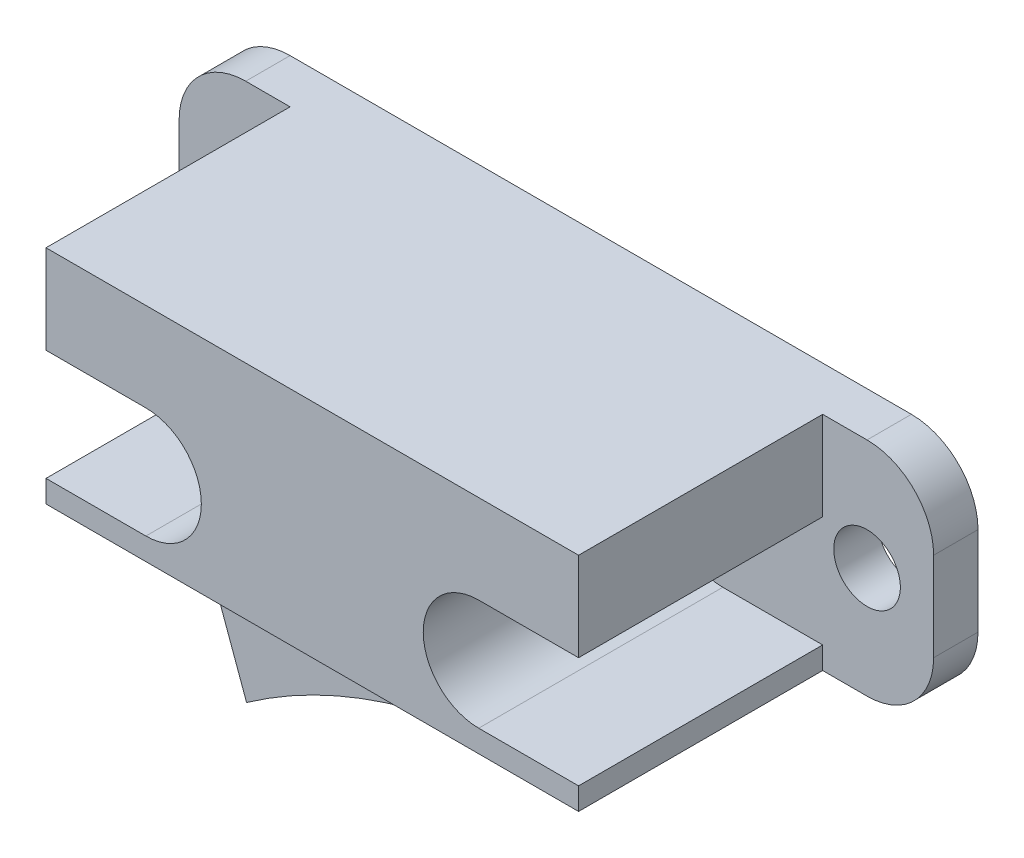
ISO-10303-21;
HEADER;
FILE_DESCRIPTION(('STEP AP214'),'2;1');
FILE_NAME('part.step','',(''),(''),'','','');
FILE_SCHEMA(('AUTOMOTIVE_DESIGN { 1 0 10303 214 1 1 1 1 }'));
ENDSEC;
DATA;
#1=APPLICATION_CONTEXT('core data for automotive mechanical design processes');
#2=APPLICATION_PROTOCOL_DEFINITION('international standard','automotive_design',2000,#1);
#3=PRODUCT_CONTEXT('',#1,'mechanical');
#4=PRODUCT('Part','Part','',(#3));
#5=PRODUCT_RELATED_PRODUCT_CATEGORY('part','',(#4));
#6=PRODUCT_DEFINITION_FORMATION('','',#4);
#7=PRODUCT_DEFINITION_CONTEXT('part definition',#1,'design');
#8=PRODUCT_DEFINITION('design','',#6,#7);
#9=PRODUCT_DEFINITION_SHAPE('','',#8);
#10=(LENGTH_UNIT() NAMED_UNIT(*) SI_UNIT(.MILLI.,.METRE.));
#11=(NAMED_UNIT(*) PLANE_ANGLE_UNIT() SI_UNIT($,.RADIAN.));
#12=(NAMED_UNIT(*) SI_UNIT($,.STERADIAN.) SOLID_ANGLE_UNIT());
#13=UNCERTAINTY_MEASURE_WITH_UNIT(LENGTH_MEASURE(1.E-05),#10,'distance_accuracy_value','');
#14=(GEOMETRIC_REPRESENTATION_CONTEXT(3) GLOBAL_UNCERTAINTY_ASSIGNED_CONTEXT((#13)) GLOBAL_UNIT_ASSIGNED_CONTEXT((#10,
#11,#12)) REPRESENTATION_CONTEXT('',''));
#15=CARTESIAN_POINT('',(0.,0.,0.));
#16=DIRECTION('',(0.,0.,1.));
#17=DIRECTION('',(1.,0.,0.));
#18=AXIS2_PLACEMENT_3D('',#15,#16,#17);
#19=CARTESIAN_POINT('',(17.,-5.,2.));
#20=DIRECTION('',(0.,1.,0.));
#21=DIRECTION('',(-1.,0.,0.));
#22=AXIS2_PLACEMENT_3D('',#19,#20,#21);
#23=PLANE('',#22);
#24=DIRECTION('',(0.,0.,-1.));
#25=VECTOR('',#24,1.);
#26=CARTESIAN_POINT('',(-10.5,-5.,-1.));
#27=LINE('',#26,#25);
#28=CARTESIAN_POINT('',(-10.5,-5.,13.));
#29=VERTEX_POINT('',#28);
#30=CARTESIAN_POINT('',(-10.5,-5.,0.));
#31=VERTEX_POINT('',#30);
#32=EDGE_CURVE('E263',#29,#31,#27,.T.);
#33=ORIENTED_EDGE('',*,*,#32,.F.);
#34=DIRECTION('',(1.,0.,0.));
#35=VECTOR('',#34,1.);
#36=CARTESIAN_POINT('',(12.,-5.,13.));
#37=LINE('',#36,#35);
#38=CARTESIAN_POINT('',(-12.,-5.,13.));
#39=VERTEX_POINT('',#38);
#40=EDGE_CURVE('E587',#39,#29,#37,.T.);
#41=ORIENTED_EDGE('',*,*,#40,.F.);
#42=DIRECTION('',(0.,0.,-1.));
#43=VECTOR('',#42,1.);
#44=CARTESIAN_POINT('',(-12.,-5.,13.));
#45=LINE('',#44,#43);
#46=CARTESIAN_POINT('',(-12.,-5.,2.));
#47=VERTEX_POINT('',#46);
#48=EDGE_CURVE('E504',#39,#47,#45,.T.);
#49=ORIENTED_EDGE('',*,*,#48,.T.);
#50=DIRECTION('',(1.,0.,0.));
#51=VECTOR('',#50,1.);
#52=CARTESIAN_POINT('',(17.,-5.,2.));
#53=LINE('',#52,#51);
#54=CARTESIAN_POINT('',(-14.,-5.,2.));
#55=VERTEX_POINT('',#54);
#56=EDGE_CURVE('E426',#55,#47,#53,.T.);
#57=ORIENTED_EDGE('',*,*,#56,.F.);
#58=DIRECTION('',(0.,0.,-1.));
#59=VECTOR('',#58,1.);
#60=CARTESIAN_POINT('',(-14.,-5.,2.));
#61=LINE('',#60,#59);
#62=CARTESIAN_POINT('',(-14.,-5.,0.));
#63=VERTEX_POINT('',#62);
#64=EDGE_CURVE('E405',#55,#63,#61,.T.);
#65=ORIENTED_EDGE('',*,*,#64,.T.);
#66=DIRECTION('',(1.,0.,0.));
#67=VECTOR('',#66,1.);
#68=CARTESIAN_POINT('',(17.,-5.,0.));
#69=LINE('',#68,#67);
#70=EDGE_CURVE('E477',#63,#31,#69,.T.);
#71=ORIENTED_EDGE('',*,*,#70,.T.);
#72=EDGE_LOOP('',(#33,#41,#49,#57,#65,#71));
#73=FACE_BOUND('',#72,.T.);
#74=ADVANCED_FACE('F35',(#73),#23,.F.);
#75=DIRECTION('',(0.,0.,1.));
#76=VECTOR('',#75,1.);
#77=CARTESIAN_POINT('',(10.5,-5.,-0.999999999999997));
#78=LINE('',#77,#76);
#79=CARTESIAN_POINT('',(10.5,-5.,0.));
#80=VERTEX_POINT('',#79);
#81=CARTESIAN_POINT('',(10.5,-5.,13.));
#82=VERTEX_POINT('',#81);
#83=EDGE_CURVE('E673',#80,#82,#78,.T.);
#84=ORIENTED_EDGE('',*,*,#83,.F.);
#85=CARTESIAN_POINT('',(14.,-5.,0.));
#86=VERTEX_POINT('',#85);
#87=EDGE_CURVE('E475',#80,#86,#69,.T.);
#88=ORIENTED_EDGE('',*,*,#87,.T.);
#89=DIRECTION('',(0.,0.,-1.));
#90=VECTOR('',#89,1.);
#91=CARTESIAN_POINT('',(14.,-5.,2.));
#92=LINE('',#91,#90);
#93=CARTESIAN_POINT('',(14.,-5.,2.));
#94=VERTEX_POINT('',#93);
#95=EDGE_CURVE('E413',#86,#94,#92,.F.);
#96=ORIENTED_EDGE('',*,*,#95,.T.);
#97=CARTESIAN_POINT('',(12.,-5.,2.));
#98=VERTEX_POINT('',#97);
#99=EDGE_CURVE('E430',#98,#94,#53,.T.);
#100=ORIENTED_EDGE('',*,*,#99,.F.);
#101=DIRECTION('',(0.,0.,-1.));
#102=VECTOR('',#101,1.);
#103=CARTESIAN_POINT('',(12.,-5.,13.));
#104=LINE('',#103,#102);
#105=CARTESIAN_POINT('',(12.,-5.,13.));
#106=VERTEX_POINT('',#105);
#107=EDGE_CURVE('E508',#106,#98,#104,.T.);
#108=ORIENTED_EDGE('',*,*,#107,.F.);
#109=EDGE_CURVE('E584',#82,#106,#37,.T.);
#110=ORIENTED_EDGE('',*,*,#109,.F.);
#111=EDGE_LOOP('',(#84,#88,#96,#100,#108,#110));
#112=FACE_BOUND('',#111,.T.);
#113=ADVANCED_FACE('F382',(#112),#23,.F.);
#114=CARTESIAN_POINT('',(0.,0.,2.));
#115=DIRECTION('',(0.,0.,1.));
#116=DIRECTION('',(1.,0.,0.));
#117=AXIS2_PLACEMENT_3D('',#114,#115,#116);
#118=PLANE('',#117);
#119=DIRECTION('',(0.,1.,0.));
#120=VECTOR('',#119,1.);
#121=CARTESIAN_POINT('',(12.,5.,2.));
#122=LINE('',#121,#120);
#123=CARTESIAN_POINT('',(12.,0.999999999999997,2.));
#124=VERTEX_POINT('',#123);
#125=CARTESIAN_POINT('',(12.,5.,2.));
#126=VERTEX_POINT('',#125);
#127=EDGE_CURVE('E524',#124,#126,#122,.T.);
#128=ORIENTED_EDGE('',*,*,#127,.F.);
#129=DIRECTION('',(1.,0.,0.));
#130=VECTOR('',#129,1.);
#131=CARTESIAN_POINT('',(12.,0.999999999999997,2.));
#132=LINE('',#131,#130);
#133=CARTESIAN_POINT('',(7.5,0.999999999999997,2.));
#134=VERTEX_POINT('',#133);
#135=EDGE_CURVE('E521',#134,#124,#132,.T.);
#136=ORIENTED_EDGE('',*,*,#135,.F.);
#137=CARTESIAN_POINT('',(7.5,-1.5,2.));
#138=DIRECTION('',(0.,0.,-1.));
#139=DIRECTION('',(1.,0.,0.));
#140=AXIS2_PLACEMENT_3D('',#137,#138,#139);
#141=CIRCLE('',#140,2.5);
#142=CARTESIAN_POINT('',(7.5,-4.,2.));
#143=VERTEX_POINT('',#142);
#144=EDGE_CURVE('E554',#143,#134,#141,.T.);
#145=ORIENTED_EDGE('',*,*,#144,.F.);
#146=DIRECTION('',(-1.,0.,0.));
#147=VECTOR('',#146,1.);
#148=CARTESIAN_POINT('',(12.,-4.,2.));
#149=LINE('',#148,#147);
#150=CARTESIAN_POINT('',(12.,-4.,2.));
#151=VERTEX_POINT('',#150);
#152=EDGE_CURVE('E538',#151,#143,#149,.T.);
#153=ORIENTED_EDGE('',*,*,#152,.F.);
#154=DIRECTION('',(0.,1.,0.));
#155=VECTOR('',#154,1.);
#156=CARTESIAN_POINT('',(12.,-5.,2.));
#157=LINE('',#156,#155);
#158=EDGE_CURVE('E535',#98,#151,#157,.T.);
#159=ORIENTED_EDGE('',*,*,#158,.F.);
#160=ORIENTED_EDGE('',*,*,#99,.T.);
#161=CARTESIAN_POINT('',(14.,-2.,2.));
#162=DIRECTION('',(0.,0.,1.));
#163=DIRECTION('',(1.,0.,0.));
#164=AXIS2_PLACEMENT_3D('',#161,#162,#163);
#165=CIRCLE('',#164,3.);
#166=CARTESIAN_POINT('',(17.,-2.,2.));
#167=VERTEX_POINT('',#166);
#168=EDGE_CURVE('E411',#94,#167,#165,.T.);
#169=ORIENTED_EDGE('',*,*,#168,.T.);
#170=DIRECTION('',(0.,1.,0.));
#171=VECTOR('',#170,1.);
#172=CARTESIAN_POINT('',(17.,-5.,2.));
#173=LINE('',#172,#171);
#174=CARTESIAN_POINT('',(17.,2.,2.));
#175=VERTEX_POINT('',#174);
#176=EDGE_CURVE('E429',#167,#175,#173,.T.);
#177=ORIENTED_EDGE('',*,*,#176,.T.);
#178=CARTESIAN_POINT('',(14.,2.,2.));
#179=DIRECTION('',(0.,0.,1.));
#180=DIRECTION('',(1.,0.,0.));
#181=AXIS2_PLACEMENT_3D('',#178,#179,#180);
#182=CIRCLE('',#181,3.);
#183=CARTESIAN_POINT('',(14.,5.,2.));
#184=VERTEX_POINT('',#183);
#185=EDGE_CURVE('E408',#175,#184,#182,.T.);
#186=ORIENTED_EDGE('',*,*,#185,.T.);
#187=DIRECTION('',(-1.,0.,0.));
#188=VECTOR('',#187,1.);
#189=CARTESIAN_POINT('',(17.,5.,2.));
#190=LINE('',#189,#188);
#191=EDGE_CURVE('E448',#184,#126,#190,.T.);
#192=ORIENTED_EDGE('',*,*,#191,.T.);
#193=EDGE_LOOP('',(#128,#136,#145,#153,#159,#160,#169,#177,#186,#192));
#194=FACE_BOUND('',#193,.T.);
#195=CARTESIAN_POINT('',(14.,0.,2.));
#196=DIRECTION('',(0.,0.,1.));
#197=DIRECTION('',(-1.,0.,0.));
#198=AXIS2_PLACEMENT_3D('',#195,#196,#197);
#199=CIRCLE('',#198,1.5);
#200=CARTESIAN_POINT('',(12.5,0.,2.));
#201=VERTEX_POINT('',#200);
#202=EDGE_CURVE('E486',#201,#201,#199,.T.);
#203=ORIENTED_EDGE('',*,*,#202,.F.);
#204=EDGE_LOOP('',(#203));
#205=FACE_BOUND('',#204,.T.);
#206=ADVANCED_FACE('F367',(#194,#205),#118,.T.);
#207=CARTESIAN_POINT('',(-17.,-5.,2.));
#208=DIRECTION('',(1.,0.,0.));
#209=DIRECTION('',(0.,0.,-1.));
#210=AXIS2_PLACEMENT_3D('',#207,#208,#209);
#211=PLANE('',#210);
#212=DIRECTION('',(0.,-1.,0.));
#213=VECTOR('',#212,1.);
#214=CARTESIAN_POINT('',(-17.,-5.,0.));
#215=LINE('',#214,#213);
#216=CARTESIAN_POINT('',(-17.,2.,0.));
#217=VERTEX_POINT('',#216);
#218=CARTESIAN_POINT('',(-17.,-2.,0.));
#219=VERTEX_POINT('',#218);
#220=EDGE_CURVE('E443',#217,#219,#215,.T.);
#221=ORIENTED_EDGE('',*,*,#220,.T.);
#222=DIRECTION('',(0.,0.,-1.));
#223=VECTOR('',#222,1.);
#224=CARTESIAN_POINT('',(-17.,-2.,2.));
#225=LINE('',#224,#223);
#226=CARTESIAN_POINT('',(-17.,-2.,2.));
#227=VERTEX_POINT('',#226);
#228=EDGE_CURVE('E11',#219,#227,#225,.F.);
#229=ORIENTED_EDGE('',*,*,#228,.T.);
#230=DIRECTION('',(0.,-1.,0.));
#231=VECTOR('',#230,1.);
#232=CARTESIAN_POINT('',(-17.,-5.,2.));
#233=LINE('',#232,#231);
#234=CARTESIAN_POINT('',(-17.,2.,2.));
#235=VERTEX_POINT('',#234);
#236=EDGE_CURVE('E435',#235,#227,#233,.T.);
#237=ORIENTED_EDGE('',*,*,#236,.F.);
#238=DIRECTION('',(0.,0.,-1.));
#239=VECTOR('',#238,1.);
#240=CARTESIAN_POINT('',(-17.,2.,2.));
#241=LINE('',#240,#239);
#242=EDGE_CURVE('E46',#235,#217,#241,.T.);
#243=ORIENTED_EDGE('',*,*,#242,.T.);
#244=EDGE_LOOP('',(#221,#229,#237,#243));
#245=FACE_BOUND('',#244,.T.);
#246=ADVANCED_FACE('F378',(#245),#211,.F.);
#247=CARTESIAN_POINT('',(17.,-5.,2.));
#248=DIRECTION('',(-1.,0.,0.));
#249=DIRECTION('',(0.,0.,1.));
#250=AXIS2_PLACEMENT_3D('',#247,#248,#249);
#251=PLANE('',#250);
#252=ORIENTED_EDGE('',*,*,#176,.F.);
#253=DIRECTION('',(0.,0.,-1.));
#254=VECTOR('',#253,1.);
#255=CARTESIAN_POINT('',(17.,-2.,2.));
#256=LINE('',#255,#254);
#257=CARTESIAN_POINT('',(17.,-2.,0.));
#258=VERTEX_POINT('',#257);
#259=EDGE_CURVE('E453',#167,#258,#256,.T.);
#260=ORIENTED_EDGE('',*,*,#259,.T.);
#261=DIRECTION('',(0.,1.,0.));
#262=VECTOR('',#261,1.);
#263=CARTESIAN_POINT('',(17.,-5.,0.));
#264=LINE('',#263,#262);
#265=CARTESIAN_POINT('',(17.,2.,0.));
#266=VERTEX_POINT('',#265);
#267=EDGE_CURVE('E611',#258,#266,#264,.T.);
#268=ORIENTED_EDGE('',*,*,#267,.T.);
#269=DIRECTION('',(0.,0.,-1.));
#270=VECTOR('',#269,1.);
#271=CARTESIAN_POINT('',(17.,2.,2.));
#272=LINE('',#271,#270);
#273=EDGE_CURVE('E449',#266,#175,#272,.F.);
#274=ORIENTED_EDGE('',*,*,#273,.T.);
#275=EDGE_LOOP('',(#252,#260,#268,#274));
#276=FACE_BOUND('',#275,.T.);
#277=ADVANCED_FACE('F374',(#276),#251,.F.);
#278=CARTESIAN_POINT('',(17.,5.,2.));
#279=DIRECTION('',(0.,-1.,0.));
#280=DIRECTION('',(1.,0.,0.));
#281=AXIS2_PLACEMENT_3D('',#278,#279,#280);
#282=PLANE('',#281);
#283=ORIENTED_EDGE('',*,*,#191,.F.);
#284=DIRECTION('',(0.,0.,-1.));
#285=VECTOR('',#284,1.);
#286=CARTESIAN_POINT('',(14.,5.,2.));
#287=LINE('',#286,#285);
#288=CARTESIAN_POINT('',(14.,5.,0.));
#289=VERTEX_POINT('',#288);
#290=EDGE_CURVE('E421',#184,#289,#287,.T.);
#291=ORIENTED_EDGE('',*,*,#290,.T.);
#292=DIRECTION('',(-1.,0.,0.));
#293=VECTOR('',#292,1.);
#294=CARTESIAN_POINT('',(17.,5.,0.));
#295=LINE('',#294,#293);
#296=CARTESIAN_POINT('',(-14.,5.,0.));
#297=VERTEX_POINT('',#296);
#298=EDGE_CURVE('E466',#289,#297,#295,.T.);
#299=ORIENTED_EDGE('',*,*,#298,.T.);
#300=DIRECTION('',(0.,0.,-1.));
#301=VECTOR('',#300,1.);
#302=CARTESIAN_POINT('',(-14.,5.,2.));
#303=LINE('',#302,#301);
#304=CARTESIAN_POINT('',(-14.,5.,2.));
#305=VERTEX_POINT('',#304);
#306=EDGE_CURVE('E418',#297,#305,#303,.F.);
#307=ORIENTED_EDGE('',*,*,#306,.T.);
#308=CARTESIAN_POINT('',(-12.,5.,2.));
#309=VERTEX_POINT('',#308);
#310=EDGE_CURVE('E440',#309,#305,#190,.T.);
#311=ORIENTED_EDGE('',*,*,#310,.F.);
#312=DIRECTION('',(0.,0.,-1.));
#313=VECTOR('',#312,1.);
#314=CARTESIAN_POINT('',(-12.,5.,13.));
#315=LINE('',#314,#313);
#316=CARTESIAN_POINT('',(-12.,5.,13.));
#317=VERTEX_POINT('',#316);
#318=EDGE_CURVE('E489',#317,#309,#315,.T.);
#319=ORIENTED_EDGE('',*,*,#318,.F.);
#320=DIRECTION('',(-1.,0.,0.));
#321=VECTOR('',#320,1.);
#322=CARTESIAN_POINT('',(-12.,5.,13.));
#323=LINE('',#322,#321);
#324=CARTESIAN_POINT('',(12.,5.,13.));
#325=VERTEX_POINT('',#324);
#326=EDGE_CURVE('E527',#325,#317,#323,.T.);
#327=ORIENTED_EDGE('',*,*,#326,.F.);
#328=DIRECTION('',(0.,0.,-1.));
#329=VECTOR('',#328,1.);
#330=CARTESIAN_POINT('',(12.,5.,13.));
#331=LINE('',#330,#329);
#332=EDGE_CURVE('E518',#325,#126,#331,.T.);
#333=ORIENTED_EDGE('',*,*,#332,.T.);
#334=EDGE_LOOP('',(#283,#291,#299,#307,#311,#319,#327,#333));
#335=FACE_BOUND('',#334,.T.);
#336=ADVANCED_FACE('F365',(#335),#282,.F.);
#337=DIRECTION('',(0.,-1.,0.));
#338=VECTOR('',#337,1.);
#339=CARTESIAN_POINT('',(-12.,-5.,2.));
#340=LINE('',#339,#338);
#341=CARTESIAN_POINT('',(-12.,-4.,2.));
#342=VERTEX_POINT('',#341);
#343=EDGE_CURVE('E539',#342,#47,#340,.T.);
#344=ORIENTED_EDGE('',*,*,#343,.F.);
#345=DIRECTION('',(-1.,0.,0.));
#346=VECTOR('',#345,1.);
#347=CARTESIAN_POINT('',(-12.,-4.,2.));
#348=LINE('',#347,#346);
#349=CARTESIAN_POINT('',(-7.5,-4.,2.));
#350=VERTEX_POINT('',#349);
#351=EDGE_CURVE('E548',#350,#342,#348,.T.);
#352=ORIENTED_EDGE('',*,*,#351,.F.);
#353=CARTESIAN_POINT('',(-7.5,-1.5,2.));
#354=DIRECTION('',(0.,0.,-1.));
#355=DIRECTION('',(-1.,0.,0.));
#356=AXIS2_PLACEMENT_3D('',#353,#354,#355);
#357=CIRCLE('',#356,2.5);
#358=CARTESIAN_POINT('',(-7.5,0.999999999999997,2.));
#359=VERTEX_POINT('',#358);
#360=EDGE_CURVE('E572',#359,#350,#357,.T.);
#361=ORIENTED_EDGE('',*,*,#360,.F.);
#362=DIRECTION('',(1.,0.,0.));
#363=VECTOR('',#362,1.);
#364=CARTESIAN_POINT('',(-12.,0.999999999999997,2.));
#365=LINE('',#364,#363);
#366=CARTESIAN_POINT('',(-12.,0.999999999999997,2.));
#367=VERTEX_POINT('',#366);
#368=EDGE_CURVE('E570',#367,#359,#365,.T.);
#369=ORIENTED_EDGE('',*,*,#368,.F.);
#370=DIRECTION('',(0.,-1.,0.));
#371=VECTOR('',#370,1.);
#372=CARTESIAN_POINT('',(-12.,5.,2.));
#373=LINE('',#372,#371);
#374=EDGE_CURVE('E460',#309,#367,#373,.T.);
#375=ORIENTED_EDGE('',*,*,#374,.F.);
#376=ORIENTED_EDGE('',*,*,#310,.T.);
#377=CARTESIAN_POINT('',(-14.,2.,2.));
#378=DIRECTION('',(0.,0.,1.));
#379=DIRECTION('',(1.,0.,0.));
#380=AXIS2_PLACEMENT_3D('',#377,#378,#379);
#381=CIRCLE('',#380,3.);
#382=EDGE_CURVE('E409',#305,#235,#381,.T.);
#383=ORIENTED_EDGE('',*,*,#382,.T.);
#384=ORIENTED_EDGE('',*,*,#236,.T.);
#385=CARTESIAN_POINT('',(-14.,-2.,2.));
#386=DIRECTION('',(0.,0.,1.));
#387=DIRECTION('',(1.,0.,0.));
#388=AXIS2_PLACEMENT_3D('',#385,#386,#387);
#389=CIRCLE('',#388,3.);
#390=EDGE_CURVE('E403',#227,#55,#389,.T.);
#391=ORIENTED_EDGE('',*,*,#390,.T.);
#392=ORIENTED_EDGE('',*,*,#56,.T.);
#393=EDGE_LOOP('',(#344,#352,#361,#369,#375,#376,#383,#384,#391,#392));
#394=FACE_BOUND('',#393,.T.);
#395=CARTESIAN_POINT('',(-14.,0.,2.));
#396=DIRECTION('',(0.,0.,1.));
#397=DIRECTION('',(1.,0.,0.));
#398=AXIS2_PLACEMENT_3D('',#395,#396,#397);
#399=CIRCLE('',#398,1.5);
#400=CARTESIAN_POINT('',(-12.5,0.,2.));
#401=VERTEX_POINT('',#400);
#402=EDGE_CURVE('E479',#401,#401,#399,.T.);
#403=ORIENTED_EDGE('',*,*,#402,.F.);
#404=EDGE_LOOP('',(#403));
#405=FACE_BOUND('',#404,.T.);
#406=ADVANCED_FACE('F361',(#394,#405),#118,.T.);
#407=CARTESIAN_POINT('',(0.,0.,0.));
#408=DIRECTION('',(0.,0.,1.));
#409=DIRECTION('',(1.,0.,0.));
#410=AXIS2_PLACEMENT_3D('',#407,#408,#409);
#411=PLANE('',#410);
#412=CARTESIAN_POINT('',(14.,0.,0.));
#413=DIRECTION('',(0.,0.,1.));
#414=DIRECTION('',(-1.,0.,0.));
#415=AXIS2_PLACEMENT_3D('',#412,#413,#414);
#416=CIRCLE('',#415,1.5);
#417=CARTESIAN_POINT('',(12.5,0.,0.));
#418=VERTEX_POINT('',#417);
#419=EDGE_CURVE('E484',#418,#418,#416,.T.);
#420=ORIENTED_EDGE('',*,*,#419,.T.);
#421=EDGE_LOOP('',(#420));
#422=FACE_BOUND('',#421,.T.);
#423=CARTESIAN_POINT('',(-14.,0.,0.));
#424=DIRECTION('',(0.,0.,1.));
#425=DIRECTION('',(1.,0.,0.));
#426=AXIS2_PLACEMENT_3D('',#423,#424,#425);
#427=CIRCLE('',#426,1.5);
#428=CARTESIAN_POINT('',(-12.5,0.,0.));
#429=VERTEX_POINT('',#428);
#430=EDGE_CURVE('E476',#429,#429,#427,.T.);
#431=ORIENTED_EDGE('',*,*,#430,.T.);
#432=EDGE_LOOP('',(#431));
#433=FACE_BOUND('',#432,.T.);
#434=ORIENTED_EDGE('',*,*,#267,.F.);
#435=CARTESIAN_POINT('',(14.,-2.,0.));
#436=DIRECTION('',(0.,0.,1.));
#437=DIRECTION('',(1.,0.,0.));
#438=AXIS2_PLACEMENT_3D('',#435,#436,#437);
#439=CIRCLE('',#438,3.);
#440=EDGE_CURVE('E622',#258,#86,#439,.F.);
#441=ORIENTED_EDGE('',*,*,#440,.T.);
#442=ORIENTED_EDGE('',*,*,#87,.F.);
#443=DIRECTION('',(1.,0.,0.));
#444=VECTOR('',#443,1.);
#445=CARTESIAN_POINT('',(0.,-5.,0.));
#446=LINE('',#445,#444);
#447=EDGE_CURVE('E629',#31,#80,#446,.T.);
#448=ORIENTED_EDGE('',*,*,#447,.F.);
#449=ORIENTED_EDGE('',*,*,#70,.F.);
#450=CARTESIAN_POINT('',(-14.,-2.,0.));
#451=DIRECTION('',(0.,0.,1.));
#452=DIRECTION('',(1.,0.,0.));
#453=AXIS2_PLACEMENT_3D('',#450,#451,#452);
#454=CIRCLE('',#453,3.);
#455=EDGE_CURVE('E474',#63,#219,#454,.F.);
#456=ORIENTED_EDGE('',*,*,#455,.T.);
#457=ORIENTED_EDGE('',*,*,#220,.F.);
#458=CARTESIAN_POINT('',(-14.,2.,0.));
#459=DIRECTION('',(0.,0.,1.));
#460=DIRECTION('',(1.,0.,0.));
#461=AXIS2_PLACEMENT_3D('',#458,#459,#460);
#462=CIRCLE('',#461,3.);
#463=EDGE_CURVE('E468',#217,#297,#462,.F.);
#464=ORIENTED_EDGE('',*,*,#463,.T.);
#465=ORIENTED_EDGE('',*,*,#298,.F.);
#466=CARTESIAN_POINT('',(14.,2.,0.));
#467=DIRECTION('',(0.,0.,1.));
#468=DIRECTION('',(1.,0.,0.));
#469=AXIS2_PLACEMENT_3D('',#466,#467,#468);
#470=CIRCLE('',#469,3.);
#471=EDGE_CURVE('E620',#289,#266,#470,.F.);
#472=ORIENTED_EDGE('',*,*,#471,.T.);
#473=EDGE_LOOP('',(#434,#441,#442,#448,#449,#456,#457,#464,#465,#472));
#474=FACE_BOUND('',#473,.T.);
#475=ADVANCED_FACE('F364',(#422,#433,#474),#411,.F.);
#476=CARTESIAN_POINT('',(14.,-2.,2.));
#477=DIRECTION('',(0.,0.,-1.));
#478=DIRECTION('',(-1.,0.,0.));
#479=AXIS2_PLACEMENT_3D('',#476,#477,#478);
#480=CYLINDRICAL_SURFACE('',#479,3.);
#481=ORIENTED_EDGE('',*,*,#168,.F.);
#482=ORIENTED_EDGE('',*,*,#95,.F.);
#483=ORIENTED_EDGE('',*,*,#440,.F.);
#484=ORIENTED_EDGE('',*,*,#259,.F.);
#485=EDGE_LOOP('',(#481,#482,#483,#484));
#486=FACE_BOUND('',#485,.T.);
#487=ADVANCED_FACE('F370',(#486),#480,.T.);
#488=CARTESIAN_POINT('',(14.,2.,2.));
#489=DIRECTION('',(0.,0.,-1.));
#490=DIRECTION('',(-1.,0.,0.));
#491=AXIS2_PLACEMENT_3D('',#488,#489,#490);
#492=CYLINDRICAL_SURFACE('',#491,3.);
#493=ORIENTED_EDGE('',*,*,#185,.F.);
#494=ORIENTED_EDGE('',*,*,#273,.F.);
#495=ORIENTED_EDGE('',*,*,#471,.F.);
#496=ORIENTED_EDGE('',*,*,#290,.F.);
#497=EDGE_LOOP('',(#493,#494,#495,#496));
#498=FACE_BOUND('',#497,.T.);
#499=ADVANCED_FACE('F389',(#498),#492,.T.);
#500=CARTESIAN_POINT('',(-14.,-2.,2.));
#501=DIRECTION('',(0.,0.,-1.));
#502=DIRECTION('',(-1.,0.,0.));
#503=AXIS2_PLACEMENT_3D('',#500,#501,#502);
#504=CYLINDRICAL_SURFACE('',#503,3.);
#505=ORIENTED_EDGE('',*,*,#390,.F.);
#506=ORIENTED_EDGE('',*,*,#228,.F.);
#507=ORIENTED_EDGE('',*,*,#455,.F.);
#508=ORIENTED_EDGE('',*,*,#64,.F.);
#509=EDGE_LOOP('',(#505,#506,#507,#508));
#510=FACE_BOUND('',#509,.T.);
#511=ADVANCED_FACE('F392',(#510),#504,.T.);
#512=CARTESIAN_POINT('',(-14.,2.,2.));
#513=DIRECTION('',(0.,0.,-1.));
#514=DIRECTION('',(-1.,0.,0.));
#515=AXIS2_PLACEMENT_3D('',#512,#513,#514);
#516=CYLINDRICAL_SURFACE('',#515,3.);
#517=ORIENTED_EDGE('',*,*,#382,.F.);
#518=ORIENTED_EDGE('',*,*,#306,.F.);
#519=ORIENTED_EDGE('',*,*,#463,.F.);
#520=ORIENTED_EDGE('',*,*,#242,.F.);
#521=EDGE_LOOP('',(#517,#518,#519,#520));
#522=FACE_BOUND('',#521,.T.);
#523=ADVANCED_FACE('F37',(#522),#516,.T.);
#524=CARTESIAN_POINT('',(-14.,0.,0.));
#525=DIRECTION('',(0.,0.,1.));
#526=DIRECTION('',(1.,0.,0.));
#527=AXIS2_PLACEMENT_3D('',#524,#525,#526);
#528=CYLINDRICAL_SURFACE('',#527,1.5);
#529=ORIENTED_EDGE('',*,*,#430,.F.);
#530=EDGE_LOOP('',(#529));
#531=FACE_BOUND('',#530,.T.);
#532=ORIENTED_EDGE('',*,*,#402,.T.);
#533=EDGE_LOOP('',(#532));
#534=FACE_BOUND('',#533,.T.);
#535=ADVANCED_FACE('F356',(#531,#534),#528,.F.);
#536=CARTESIAN_POINT('',(14.,0.,0.));
#537=DIRECTION('',(0.,0.,1.));
#538=DIRECTION('',(1.,0.,0.));
#539=AXIS2_PLACEMENT_3D('',#536,#537,#538);
#540=CYLINDRICAL_SURFACE('',#539,1.5);
#541=ORIENTED_EDGE('',*,*,#419,.F.);
#542=EDGE_LOOP('',(#541));
#543=FACE_BOUND('',#542,.T.);
#544=ORIENTED_EDGE('',*,*,#202,.T.);
#545=EDGE_LOOP('',(#544));
#546=FACE_BOUND('',#545,.T.);
#547=ADVANCED_FACE('F352',(#543,#546),#540,.F.);
#548=CARTESIAN_POINT('',(-12.,5.,13.));
#549=DIRECTION('',(1.,0.,0.));
#550=DIRECTION('',(0.,0.,-1.));
#551=AXIS2_PLACEMENT_3D('',#548,#549,#550);
#552=PLANE('',#551);
#553=ORIENTED_EDGE('',*,*,#374,.T.);
#554=DIRECTION('',(0.,0.,-1.));
#555=VECTOR('',#554,1.);
#556=CARTESIAN_POINT('',(-12.,0.999999999999997,13.));
#557=LINE('',#556,#555);
#558=CARTESIAN_POINT('',(-12.,0.999999999999997,13.));
#559=VERTEX_POINT('',#558);
#560=EDGE_CURVE('E492',#559,#367,#557,.T.);
#561=ORIENTED_EDGE('',*,*,#560,.F.);
#562=DIRECTION('',(0.,-1.,0.));
#563=VECTOR('',#562,1.);
#564=CARTESIAN_POINT('',(-12.,5.,13.));
#565=LINE('',#564,#563);
#566=EDGE_CURVE('E642',#317,#559,#565,.T.);
#567=ORIENTED_EDGE('',*,*,#566,.F.);
#568=ORIENTED_EDGE('',*,*,#318,.T.);
#569=EDGE_LOOP('',(#553,#561,#567,#568));
#570=FACE_BOUND('',#569,.T.);
#571=ADVANCED_FACE('F348',(#570),#552,.F.);
#572=CARTESIAN_POINT('',(-12.,0.999999999999997,13.));
#573=DIRECTION('',(0.,1.,0.));
#574=DIRECTION('',(0.,0.,1.));
#575=AXIS2_PLACEMENT_3D('',#572,#573,#574);
#576=PLANE('',#575);
#577=ORIENTED_EDGE('',*,*,#368,.T.);
#578=DIRECTION('',(0.,0.,-1.));
#579=VECTOR('',#578,1.);
#580=CARTESIAN_POINT('',(-7.5,0.999999999999997,13.));
#581=LINE('',#580,#579);
#582=CARTESIAN_POINT('',(-7.5,0.999999999999997,13.));
#583=VERTEX_POINT('',#582);
#584=EDGE_CURVE('E495',#583,#359,#581,.T.);
#585=ORIENTED_EDGE('',*,*,#584,.F.);
#586=DIRECTION('',(1.,0.,0.));
#587=VECTOR('',#586,1.);
#588=CARTESIAN_POINT('',(-12.,0.999999999999997,13.));
#589=LINE('',#588,#587);
#590=EDGE_CURVE('E644',#559,#583,#589,.T.);
#591=ORIENTED_EDGE('',*,*,#590,.F.);
#592=ORIENTED_EDGE('',*,*,#560,.T.);
#593=EDGE_LOOP('',(#577,#585,#591,#592));
#594=FACE_BOUND('',#593,.T.);
#595=ADVANCED_FACE('F344',(#594),#576,.F.);
#596=CARTESIAN_POINT('',(-7.5,-1.5,13.));
#597=DIRECTION('',(0.,0.,-1.));
#598=DIRECTION('',(-1.,0.,0.));
#599=AXIS2_PLACEMENT_3D('',#596,#597,#598);
#600=CYLINDRICAL_SURFACE('',#599,2.5);
#601=ORIENTED_EDGE('',*,*,#360,.T.);
#602=DIRECTION('',(0.,0.,-1.));
#603=VECTOR('',#602,1.);
#604=CARTESIAN_POINT('',(-7.5,-4.,13.));
#605=LINE('',#604,#603);
#606=CARTESIAN_POINT('',(-7.5,-4.,13.));
#607=VERTEX_POINT('',#606);
#608=EDGE_CURVE('E498',#607,#350,#605,.T.);
#609=ORIENTED_EDGE('',*,*,#608,.F.);
#610=CARTESIAN_POINT('',(-7.5,-1.5,13.));
#611=DIRECTION('',(0.,0.,-1.));
#612=DIRECTION('',(-1.,0.,0.));
#613=AXIS2_PLACEMENT_3D('',#610,#611,#612);
#614=CIRCLE('',#613,2.5);
#615=EDGE_CURVE('E589',#583,#607,#614,.T.);
#616=ORIENTED_EDGE('',*,*,#615,.F.);
#617=ORIENTED_EDGE('',*,*,#584,.T.);
#618=EDGE_LOOP('',(#601,#609,#616,#617));
#619=FACE_BOUND('',#618,.T.);
#620=ADVANCED_FACE('F340',(#619),#600,.F.);
#621=CARTESIAN_POINT('',(-12.,-4.,13.));
#622=DIRECTION('',(0.,-1.,0.));
#623=DIRECTION('',(0.,0.,-1.));
#624=AXIS2_PLACEMENT_3D('',#621,#622,#623);
#625=PLANE('',#624);
#626=ORIENTED_EDGE('',*,*,#351,.T.);
#627=DIRECTION('',(0.,0.,-1.));
#628=VECTOR('',#627,1.);
#629=CARTESIAN_POINT('',(-12.,-4.,13.));
#630=LINE('',#629,#628);
#631=CARTESIAN_POINT('',(-12.,-4.,13.));
#632=VERTEX_POINT('',#631);
#633=EDGE_CURVE('E501',#632,#342,#630,.T.);
#634=ORIENTED_EDGE('',*,*,#633,.F.);
#635=DIRECTION('',(-1.,0.,0.));
#636=VECTOR('',#635,1.);
#637=CARTESIAN_POINT('',(-12.,-4.,13.));
#638=LINE('',#637,#636);
#639=EDGE_CURVE('E585',#607,#632,#638,.T.);
#640=ORIENTED_EDGE('',*,*,#639,.F.);
#641=ORIENTED_EDGE('',*,*,#608,.T.);
#642=EDGE_LOOP('',(#626,#634,#640,#641));
#643=FACE_BOUND('',#642,.T.);
#644=ADVANCED_FACE('F336',(#643),#625,.F.);
#645=CARTESIAN_POINT('',(-12.,-5.,13.));
#646=DIRECTION('',(1.,0.,0.));
#647=DIRECTION('',(0.,0.,-1.));
#648=AXIS2_PLACEMENT_3D('',#645,#646,#647);
#649=PLANE('',#648);
#650=ORIENTED_EDGE('',*,*,#343,.T.);
#651=ORIENTED_EDGE('',*,*,#48,.F.);
#652=DIRECTION('',(0.,-1.,0.));
#653=VECTOR('',#652,1.);
#654=CARTESIAN_POINT('',(-12.,-5.,13.));
#655=LINE('',#654,#653);
#656=EDGE_CURVE('E581',#632,#39,#655,.T.);
#657=ORIENTED_EDGE('',*,*,#656,.F.);
#658=ORIENTED_EDGE('',*,*,#633,.T.);
#659=EDGE_LOOP('',(#650,#651,#657,#658));
#660=FACE_BOUND('',#659,.T.);
#661=ADVANCED_FACE('F332',(#660),#649,.F.);
#662=CARTESIAN_POINT('',(12.,-5.,13.));
#663=DIRECTION('',(-1.,0.,0.));
#664=DIRECTION('',(0.,0.,1.));
#665=AXIS2_PLACEMENT_3D('',#662,#663,#664);
#666=PLANE('',#665);
#667=ORIENTED_EDGE('',*,*,#158,.T.);
#668=DIRECTION('',(0.,0.,-1.));
#669=VECTOR('',#668,1.);
#670=CARTESIAN_POINT('',(12.,-4.,13.));
#671=LINE('',#670,#669);
#672=CARTESIAN_POINT('',(12.,-4.,13.));
#673=VERTEX_POINT('',#672);
#674=EDGE_CURVE('E505',#673,#151,#671,.T.);
#675=ORIENTED_EDGE('',*,*,#674,.F.);
#676=DIRECTION('',(0.,1.,0.));
#677=VECTOR('',#676,1.);
#678=CARTESIAN_POINT('',(12.,-5.,13.));
#679=LINE('',#678,#677);
#680=EDGE_CURVE('E593',#106,#673,#679,.T.);
#681=ORIENTED_EDGE('',*,*,#680,.F.);
#682=ORIENTED_EDGE('',*,*,#107,.T.);
#683=EDGE_LOOP('',(#667,#675,#681,#682));
#684=FACE_BOUND('',#683,.T.);
#685=ADVANCED_FACE('F328',(#684),#666,.F.);
#686=CARTESIAN_POINT('',(12.,-4.,13.));
#687=DIRECTION('',(0.,-1.,0.));
#688=DIRECTION('',(0.,0.,-1.));
#689=AXIS2_PLACEMENT_3D('',#686,#687,#688);
#690=PLANE('',#689);
#691=ORIENTED_EDGE('',*,*,#152,.T.);
#692=DIRECTION('',(0.,0.,-1.));
#693=VECTOR('',#692,1.);
#694=CARTESIAN_POINT('',(7.5,-4.,13.));
#695=LINE('',#694,#693);
#696=CARTESIAN_POINT('',(7.5,-4.,13.));
#697=VERTEX_POINT('',#696);
#698=EDGE_CURVE('E509',#697,#143,#695,.T.);
#699=ORIENTED_EDGE('',*,*,#698,.F.);
#700=DIRECTION('',(-1.,0.,0.));
#701=VECTOR('',#700,1.);
#702=CARTESIAN_POINT('',(12.,-4.,13.));
#703=LINE('',#702,#701);
#704=EDGE_CURVE('E595',#673,#697,#703,.T.);
#705=ORIENTED_EDGE('',*,*,#704,.F.);
#706=ORIENTED_EDGE('',*,*,#674,.T.);
#707=EDGE_LOOP('',(#691,#699,#705,#706));
#708=FACE_BOUND('',#707,.T.);
#709=ADVANCED_FACE('F324',(#708),#690,.F.);
#710=CARTESIAN_POINT('',(7.5,-1.5,13.));
#711=DIRECTION('',(0.,0.,-1.));
#712=DIRECTION('',(-1.,0.,0.));
#713=AXIS2_PLACEMENT_3D('',#710,#711,#712);
#714=CYLINDRICAL_SURFACE('',#713,2.5);
#715=ORIENTED_EDGE('',*,*,#144,.T.);
#716=DIRECTION('',(0.,0.,-1.));
#717=VECTOR('',#716,1.);
#718=CARTESIAN_POINT('',(7.5,0.999999999999997,13.));
#719=LINE('',#718,#717);
#720=CARTESIAN_POINT('',(7.5,0.999999999999997,13.));
#721=VERTEX_POINT('',#720);
#722=EDGE_CURVE('E512',#721,#134,#719,.T.);
#723=ORIENTED_EDGE('',*,*,#722,.F.);
#724=CARTESIAN_POINT('',(7.5,-1.5,13.));
#725=DIRECTION('',(0.,0.,-1.));
#726=DIRECTION('',(1.,0.,0.));
#727=AXIS2_PLACEMENT_3D('',#724,#725,#726);
#728=CIRCLE('',#727,2.5);
#729=EDGE_CURVE('E566',#697,#721,#728,.T.);
#730=ORIENTED_EDGE('',*,*,#729,.F.);
#731=ORIENTED_EDGE('',*,*,#698,.T.);
#732=EDGE_LOOP('',(#715,#723,#730,#731));
#733=FACE_BOUND('',#732,.T.);
#734=ADVANCED_FACE('F320',(#733),#714,.F.);
#735=CARTESIAN_POINT('',(12.,0.999999999999997,13.));
#736=DIRECTION('',(0.,1.,0.));
#737=DIRECTION('',(0.,0.,1.));
#738=AXIS2_PLACEMENT_3D('',#735,#736,#737);
#739=PLANE('',#738);
#740=ORIENTED_EDGE('',*,*,#135,.T.);
#741=DIRECTION('',(0.,0.,-1.));
#742=VECTOR('',#741,1.);
#743=CARTESIAN_POINT('',(12.,0.999999999999997,13.));
#744=LINE('',#743,#742);
#745=CARTESIAN_POINT('',(12.,0.999999999999997,13.));
#746=VERTEX_POINT('',#745);
#747=EDGE_CURVE('E515',#746,#124,#744,.T.);
#748=ORIENTED_EDGE('',*,*,#747,.F.);
#749=DIRECTION('',(1.,0.,0.));
#750=VECTOR('',#749,1.);
#751=CARTESIAN_POINT('',(12.,0.999999999999997,13.));
#752=LINE('',#751,#750);
#753=EDGE_CURVE('E564',#721,#746,#752,.T.);
#754=ORIENTED_EDGE('',*,*,#753,.F.);
#755=ORIENTED_EDGE('',*,*,#722,.T.);
#756=EDGE_LOOP('',(#740,#748,#754,#755));
#757=FACE_BOUND('',#756,.T.);
#758=ADVANCED_FACE('F316',(#757),#739,.F.);
#759=CARTESIAN_POINT('',(12.,5.,13.));
#760=DIRECTION('',(-1.,0.,0.));
#761=DIRECTION('',(0.,0.,1.));
#762=AXIS2_PLACEMENT_3D('',#759,#760,#761);
#763=PLANE('',#762);
#764=ORIENTED_EDGE('',*,*,#127,.T.);
#765=ORIENTED_EDGE('',*,*,#332,.F.);
#766=DIRECTION('',(0.,1.,0.));
#767=VECTOR('',#766,1.);
#768=CARTESIAN_POINT('',(12.,5.,13.));
#769=LINE('',#768,#767);
#770=EDGE_CURVE('E532',#746,#325,#769,.T.);
#771=ORIENTED_EDGE('',*,*,#770,.F.);
#772=ORIENTED_EDGE('',*,*,#747,.T.);
#773=EDGE_LOOP('',(#764,#765,#771,#772));
#774=FACE_BOUND('',#773,.T.);
#775=ADVANCED_FACE('F312',(#774),#763,.F.);
#776=CARTESIAN_POINT('',(7.5,-1.5,13.));
#777=DIRECTION('',(0.,0.,1.));
#778=DIRECTION('',(1.,0.,0.));
#779=AXIS2_PLACEMENT_3D('',#776,#777,#778);
#780=PLANE('',#779);
#781=ORIENTED_EDGE('',*,*,#326,.T.);
#782=ORIENTED_EDGE('',*,*,#566,.T.);
#783=ORIENTED_EDGE('',*,*,#590,.T.);
#784=ORIENTED_EDGE('',*,*,#615,.T.);
#785=ORIENTED_EDGE('',*,*,#639,.T.);
#786=ORIENTED_EDGE('',*,*,#656,.T.);
#787=ORIENTED_EDGE('',*,*,#40,.T.);
#788=DIRECTION('',(-1.,0.,0.));
#789=VECTOR('',#788,1.);
#790=CARTESIAN_POINT('',(10.5,-5.,13.));
#791=LINE('',#790,#789);
#792=EDGE_CURVE('E664',#82,#29,#791,.T.);
#793=ORIENTED_EDGE('',*,*,#792,.F.);
#794=ORIENTED_EDGE('',*,*,#109,.T.);
#795=ORIENTED_EDGE('',*,*,#680,.T.);
#796=ORIENTED_EDGE('',*,*,#704,.T.);
#797=ORIENTED_EDGE('',*,*,#729,.T.);
#798=ORIENTED_EDGE('',*,*,#753,.T.);
#799=ORIENTED_EDGE('',*,*,#770,.T.);
#800=EDGE_LOOP('',(#781,#782,#783,#784,#785,#786,#787,#793,#794,#795,#796,#797,#798,#799));
#801=FACE_BOUND('',#800,.T.);
#802=ADVANCED_FACE('F294',(#801),#780,.T.);
#803=CARTESIAN_POINT('',(0.,-5.,0.));
#804=DIRECTION('',(0.,-1.,0.));
#805=DIRECTION('',(1.,0.,0.));
#806=AXIS2_PLACEMENT_3D('',#803,#804,#805);
#807=PLANE('',#806);
#808=CARTESIAN_POINT('',(-10.5,-5.,-1.));
#809=VERTEX_POINT('',#808);
#810=EDGE_CURVE('E272',#31,#809,#27,.T.);
#811=ORIENTED_EDGE('',*,*,#810,.F.);
#812=ORIENTED_EDGE('',*,*,#447,.T.);
#813=CARTESIAN_POINT('',(10.5,-5.,-0.999999999999997));
#814=VERTEX_POINT('',#813);
#815=EDGE_CURVE('E672',#814,#80,#78,.T.);
#816=ORIENTED_EDGE('',*,*,#815,.F.);
#817=DIRECTION('',(1.,0.,0.));
#818=VECTOR('',#817,1.);
#819=CARTESIAN_POINT('',(10.5,-5.,-0.999999999999997));
#820=LINE('',#819,#818);
#821=EDGE_CURVE('E674',#809,#814,#820,.T.);
#822=ORIENTED_EDGE('',*,*,#821,.F.);
#823=EDGE_LOOP('',(#811,#812,#816,#822));
#824=FACE_BOUND('',#823,.T.);
#825=ADVANCED_FACE('F289',(#824),#807,.F.);
#826=CARTESIAN_POINT('',(-10.5,-5.,-1.));
#827=DIRECTION('',(-0.669130606358857,-0.743144825477395,0.));
#828=DIRECTION('',(0.743144825477395,-0.669130606358857,0.));
#829=AXIS2_PLACEMENT_3D('',#826,#827,#828);
#830=PLANE('',#829);
#831=ORIENTED_EDGE('',*,*,#32,.T.);
#832=ORIENTED_EDGE('',*,*,#810,.T.);
#833=DIRECTION('',(-0.5964727848721,0.537066507812433,-0.5964727848721));
#834=VECTOR('',#833,1.);
#835=CARTESIAN_POINT('',(-3.02862455504534,-11.7272566671047,6.47137544495465));
#836=LINE('',#835,#834);
#837=CARTESIAN_POINT('',(-8.27877497034161,-7.,1.22122502965839));
#838=VERTEX_POINT('',#837);
#839=EDGE_CURVE('E632',#838,#809,#836,.T.);
#840=ORIENTED_EDGE('',*,*,#839,.F.);
#841=DIRECTION('',(0.,0.,1.));
#842=VECTOR('',#841,1.);
#843=CARTESIAN_POINT('',(-8.27877497034161,-7.,-1.));
#844=LINE('',#843,#842);
#845=CARTESIAN_POINT('',(-8.27877497034161,-7.,10.7787749703416));
#846=VERTEX_POINT('',#845);
#847=EDGE_CURVE('E661',#846,#838,#844,.F.);
#848=ORIENTED_EDGE('',*,*,#847,.F.);
#849=DIRECTION('',(-0.5964727848721,0.537066507812433,0.5964727848721));
#850=VECTOR('',#849,1.);
#851=CARTESIAN_POINT('',(-5.5190830366969,-9.48483777806982,8.0190830366969));
#852=LINE('',#851,#850);
#853=EDGE_CURVE('E656',#846,#29,#852,.T.);
#854=ORIENTED_EDGE('',*,*,#853,.T.);
#855=EDGE_LOOP('',(#831,#832,#840,#848,#854));
#856=FACE_BOUND('',#855,.T.);
#857=ADVANCED_FACE('F293',(#856),#830,.T.);
#858=CARTESIAN_POINT('',(10.5,-5.,-0.999999999999997));
#859=DIRECTION('',(0.,-0.743144825477395,-0.669130606358857));
#860=DIRECTION('',(0.,0.669130606358858,-0.743144825477395));
#861=AXIS2_PLACEMENT_3D('',#858,#859,#860);
#862=PLANE('',#861);
#863=ORIENTED_EDGE('',*,*,#821,.T.);
#864=DIRECTION('',(0.5964727848721,0.537066507812434,-0.5964727848721));
#865=VECTOR('',#864,1.);
#866=CARTESIAN_POINT('',(10.5,-5.,-0.999999999999997));
#867=LINE('',#866,#865);
#868=CARTESIAN_POINT('',(8.27877497034161,-7.,1.22122502965839));
#869=VERTEX_POINT('',#868);
#870=EDGE_CURVE('E635',#869,#814,#867,.T.);
#871=ORIENTED_EDGE('',*,*,#870,.F.);
#872=DIRECTION('',(-1.,0.,0.));
#873=VECTOR('',#872,1.);
#874=CARTESIAN_POINT('',(10.5,-7.,1.22122502965839));
#875=LINE('',#874,#873);
#876=EDGE_CURVE('E659',#838,#869,#875,.F.);
#877=ORIENTED_EDGE('',*,*,#876,.F.);
#878=ORIENTED_EDGE('',*,*,#839,.T.);
#879=EDGE_LOOP('',(#863,#871,#877,#878));
#880=FACE_BOUND('',#879,.T.);
#881=ADVANCED_FACE('F298',(#880),#862,.T.);
#882=CARTESIAN_POINT('',(10.5,-5.,-0.999999999999997));
#883=DIRECTION('',(0.669130606358858,-0.743144825477395,0.));
#884=DIRECTION('',(0.743144825477395,0.669130606358858,0.));
#885=AXIS2_PLACEMENT_3D('',#882,#883,#884);
#886=PLANE('',#885);
#887=ORIENTED_EDGE('',*,*,#815,.T.);
#888=ORIENTED_EDGE('',*,*,#83,.T.);
#889=DIRECTION('',(0.5964727848721,0.537066507812434,0.5964727848721));
#890=VECTOR('',#889,1.);
#891=CARTESIAN_POINT('',(10.5,-5.,13.));
#892=LINE('',#891,#890);
#893=CARTESIAN_POINT('',(8.27877497034161,-7.,10.7787749703416));
#894=VERTEX_POINT('',#893);
#895=EDGE_CURVE('E667',#894,#82,#892,.T.);
#896=ORIENTED_EDGE('',*,*,#895,.F.);
#897=DIRECTION('',(0.,0.,-1.));
#898=VECTOR('',#897,1.);
#899=CARTESIAN_POINT('',(8.27877497034161,-7.,-0.999999999999997));
#900=LINE('',#899,#898);
#901=EDGE_CURVE('E657',#869,#894,#900,.F.);
#902=ORIENTED_EDGE('',*,*,#901,.F.);
#903=ORIENTED_EDGE('',*,*,#870,.T.);
#904=EDGE_LOOP('',(#887,#888,#896,#902,#903));
#905=FACE_BOUND('',#904,.T.);
#906=ADVANCED_FACE('F302',(#905),#886,.T.);
#907=CARTESIAN_POINT('',(10.5,-5.,13.));
#908=DIRECTION('',(0.,-0.743144825477395,0.669130606358857));
#909=DIRECTION('',(0.,-0.669130606358858,-0.743144825477395));
#910=AXIS2_PLACEMENT_3D('',#907,#908,#909);
#911=PLANE('',#910);
#912=ORIENTED_EDGE('',*,*,#792,.T.);
#913=ORIENTED_EDGE('',*,*,#853,.F.);
#914=DIRECTION('',(1.,0.,0.));
#915=VECTOR('',#914,1.);
#916=CARTESIAN_POINT('',(10.5,-7.,10.7787749703416));
#917=LINE('',#916,#915);
#918=EDGE_CURVE('E639',#894,#846,#917,.F.);
#919=ORIENTED_EDGE('',*,*,#918,.F.);
#920=ORIENTED_EDGE('',*,*,#895,.T.);
#921=EDGE_LOOP('',(#912,#913,#919,#920));
#922=FACE_BOUND('',#921,.T.);
#923=ADVANCED_FACE('F287',(#922),#911,.T.);
#924=CARTESIAN_POINT('',(0.,-7.,0.));
#925=DIRECTION('',(0.,-1.,0.));
#926=DIRECTION('',(1.,0.,0.));
#927=AXIS2_PLACEMENT_3D('',#924,#925,#926);
#928=PLANE('',#927);
#929=DIRECTION('',(0.,0.,-1.));
#930=VECTOR('',#929,1.);
#931=CARTESIAN_POINT('',(-7.5,-7.,2.));
#932=LINE('',#931,#930);
#933=CARTESIAN_POINT('',(-7.5,-7.,10.));
#934=VERTEX_POINT('',#933);
#935=CARTESIAN_POINT('',(-7.5,-7.,2.));
#936=VERTEX_POINT('',#935);
#937=EDGE_CURVE('E258',#934,#936,#932,.T.);
#938=ORIENTED_EDGE('',*,*,#937,.F.);
#939=DIRECTION('',(1.,0.,0.));
#940=VECTOR('',#939,1.);
#941=CARTESIAN_POINT('',(0.,-7.,10.));
#942=LINE('',#941,#940);
#943=CARTESIAN_POINT('',(7.22986361457221,-7.,10.));
#944=VERTEX_POINT('',#943);
#945=EDGE_CURVE('E54',#934,#944,#942,.T.);
#946=ORIENTED_EDGE('',*,*,#945,.T.);
#947=CARTESIAN_POINT('',(7.22986361457221,-7.,10.));
#948=DIRECTION('',(1.,0.,0.));
#949=VECTOR('',#948,1.);
#950=LINE('',#947,#949);
#951=CARTESIAN_POINT('',(7.5,-7.,10.));
#952=VERTEX_POINT('',#951);
#953=EDGE_CURVE('E236',#944,#952,#950,.T.);
#954=ORIENTED_EDGE('',*,*,#953,.T.);
#955=DIRECTION('',(0.,0.,1.));
#956=VECTOR('',#955,1.);
#957=CARTESIAN_POINT('',(7.5,-7.,2.));
#958=LINE('',#957,#956);
#959=CARTESIAN_POINT('',(7.5,-7.,2.));
#960=VERTEX_POINT('',#959);
#961=EDGE_CURVE('E268',#960,#952,#958,.T.);
#962=ORIENTED_EDGE('',*,*,#961,.F.);
#963=CARTESIAN_POINT('',(7.36493180728625,-30.1093296928713,2.));
#964=DIRECTION('',(0.,0.,-1.));
#965=DIRECTION('',(-0.00584464748788161,0.999982919902006,0.));
#966=AXIS2_PLACEMENT_3D('',#963,#964,#965);
#967=CIRCLE('',#966,23.1097244092288);
#968=CARTESIAN_POINT('',(7.22986361457221,-7.,2.));
#969=VERTEX_POINT('',#968);
#970=EDGE_CURVE('E61',#969,#960,#967,.T.);
#971=ORIENTED_EDGE('',*,*,#970,.F.);
#972=DIRECTION('',(1.,0.,0.));
#973=VECTOR('',#972,1.);
#974=CARTESIAN_POINT('',(7.5,-7.,2.));
#975=LINE('',#974,#973);
#976=EDGE_CURVE('E260',#936,#969,#975,.T.);
#977=ORIENTED_EDGE('',*,*,#976,.F.);
#978=EDGE_LOOP('',(#938,#946,#954,#962,#971,#977));
#979=FACE_BOUND('',#978,.T.);
#980=ORIENTED_EDGE('',*,*,#847,.T.);
#981=ORIENTED_EDGE('',*,*,#876,.T.);
#982=ORIENTED_EDGE('',*,*,#901,.T.);
#983=ORIENTED_EDGE('',*,*,#918,.T.);
#984=EDGE_LOOP('',(#980,#981,#982,#983));
#985=FACE_BOUND('',#984,.T.);
#986=ADVANCED_FACE('F277',(#979,#985),#928,.T.);
#987=CARTESIAN_POINT('',(-7.5,-7.,10.));
#988=DIRECTION('',(0.939692620785907,0.342020143325673,0.));
#989=DIRECTION('',(-0.342020143325673,0.939692620785907,0.));
#990=AXIS2_PLACEMENT_3D('',#987,#988,#989);
#991=PLANE('',#990);
#992=DIRECTION('',(0.342020143325673,-0.939692620785907,0.));
#993=VECTOR('',#992,1.);
#994=CARTESIAN_POINT('',(-7.5,-7.,2.));
#995=LINE('',#994,#993);
#996=CARTESIAN_POINT('',(-5.96090935503447,-11.2286167935366,2.));
#997=VERTEX_POINT('',#996);
#998=EDGE_CURVE('E243',#936,#997,#995,.T.);
#999=ORIENTED_EDGE('',*,*,#998,.T.);
#1000=DIRECTION('',(0.,0.,-1.));
#1001=VECTOR('',#1000,1.);
#1002=CARTESIAN_POINT('',(-5.96090935503447,-11.2286167935366,10.));
#1003=LINE('',#1002,#1001);
#1004=CARTESIAN_POINT('',(-5.96090935503447,-11.2286167935366,10.));
#1005=VERTEX_POINT('',#1004);
#1006=EDGE_CURVE('E240',#1005,#997,#1003,.T.);
#1007=ORIENTED_EDGE('',*,*,#1006,.F.);
#1008=DIRECTION('',(0.342020143325673,-0.939692620785907,0.));
#1009=VECTOR('',#1008,1.);
#1010=CARTESIAN_POINT('',(-7.5,-7.,10.));
#1011=LINE('',#1010,#1009);
#1012=EDGE_CURVE('E229',#934,#1005,#1011,.T.);
#1013=ORIENTED_EDGE('',*,*,#1012,.F.);
#1014=ORIENTED_EDGE('',*,*,#937,.T.);
#1015=EDGE_LOOP('',(#999,#1007,#1013,#1014));
#1016=FACE_BOUND('',#1015,.T.);
#1017=ADVANCED_FACE('F241',(#1016),#991,.F.);
#1018=CARTESIAN_POINT('',(7.36493180728625,-30.1093296928713,10.));
#1019=DIRECTION('',(0.,0.,-1.));
#1020=DIRECTION('',(-1.,0.,0.));
#1021=AXIS2_PLACEMENT_3D('',#1018,#1019,#1020);
#1022=CYLINDRICAL_SURFACE('',#1021,23.1097244092288);
#1023=CARTESIAN_POINT('',(7.36493180728625,-30.1093296928713,2.));
#1024=DIRECTION('',(0.,0.,-1.));
#1025=DIRECTION('',(-1.,0.,0.));
#1026=AXIS2_PLACEMENT_3D('',#1023,#1024,#1025);
#1027=CIRCLE('',#1026,23.1097244092288);
#1028=EDGE_CURVE('E237',#997,#969,#1027,.T.);
#1029=ORIENTED_EDGE('',*,*,#1028,.T.);
#1030=ORIENTED_EDGE('',*,*,#970,.T.);
#1031=ORIENTED_EDGE('',*,*,#961,.T.);
#1032=ORIENTED_EDGE('',*,*,#953,.F.);
#1033=CARTESIAN_POINT('',(7.36493180728625,-30.1093296928713,10.));
#1034=DIRECTION('',(0.,0.,-1.));
#1035=DIRECTION('',(-1.,0.,0.));
#1036=AXIS2_PLACEMENT_3D('',#1033,#1034,#1035);
#1037=CIRCLE('',#1036,23.1097244092288);
#1038=EDGE_CURVE('E233',#1005,#944,#1037,.T.);
#1039=ORIENTED_EDGE('',*,*,#1038,.F.);
#1040=ORIENTED_EDGE('',*,*,#1006,.T.);
#1041=EDGE_LOOP('',(#1029,#1030,#1031,#1032,#1039,#1040));
#1042=FACE_BOUND('',#1041,.T.);
#1043=ADVANCED_FACE('F248',(#1042),#1022,.F.);
#1044=CARTESIAN_POINT('',(7.36493180728625,-30.1093296928713,10.));
#1045=DIRECTION('',(0.,0.,-1.));
#1046=DIRECTION('',(-1.,0.,0.));
#1047=AXIS2_PLACEMENT_3D('',#1044,#1045,#1046);
#1048=PLANE('',#1047);
#1049=ORIENTED_EDGE('',*,*,#945,.F.);
#1050=ORIENTED_EDGE('',*,*,#1012,.T.);
#1051=ORIENTED_EDGE('',*,*,#1038,.T.);
#1052=EDGE_LOOP('',(#1049,#1050,#1051));
#1053=FACE_BOUND('',#1052,.T.);
#1054=ADVANCED_FACE('F231',(#1053),#1048,.F.);
#1055=CARTESIAN_POINT('',(7.36493180728625,-30.1093296928713,2.));
#1056=DIRECTION('',(0.,0.,-1.));
#1057=DIRECTION('',(-1.,0.,0.));
#1058=AXIS2_PLACEMENT_3D('',#1055,#1056,#1057);
#1059=PLANE('',#1058);
#1060=ORIENTED_EDGE('',*,*,#998,.F.);
#1061=ORIENTED_EDGE('',*,*,#976,.T.);
#1062=ORIENTED_EDGE('',*,*,#1028,.F.);
#1063=EDGE_LOOP('',(#1060,#1061,#1062));
#1064=FACE_BOUND('',#1063,.T.);
#1065=ADVANCED_FACE('F829',(#1064),#1059,.T.);
#1066=CLOSED_SHELL('',(#74,#113,#206,#246,#277,#336,#406,#475,#487,#499,#511,#523,#535,#547,
#571,#595,#620,#644,#661,#685,#709,#734,#758,#775,#802,#825,#857,#881,#906,#923,#986,#1017,
#1043,#1054,#1065));
#1067=MANIFOLD_SOLID_BREP('B2',#1066);
#1068=ADVANCED_BREP_SHAPE_REPRESENTATION('',(#18,#1067),#14);
#1069=SHAPE_DEFINITION_REPRESENTATION(#9,#1068);
ENDSEC;
END-ISO-10303-21;
